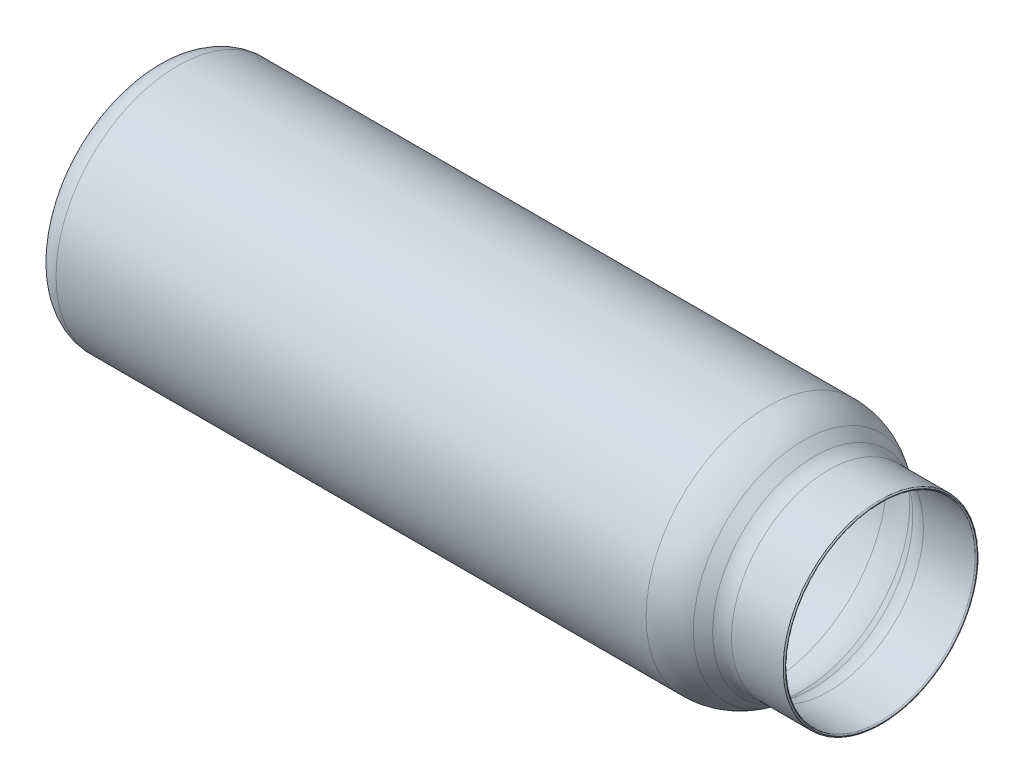
ISO-10303-21;
HEADER;
FILE_DESCRIPTION(('STEP AP214'),'2;1');
FILE_NAME('part.step','',(''),(''),'','','');
FILE_SCHEMA(('AUTOMOTIVE_DESIGN { 1 0 10303 214 1 1 1 1 }'));
ENDSEC;
DATA;
#1=APPLICATION_CONTEXT('core data for automotive mechanical design processes');
#2=APPLICATION_PROTOCOL_DEFINITION('international standard','automotive_design',2000,#1);
#3=PRODUCT_CONTEXT('',#1,'mechanical');
#4=PRODUCT('Part','Part','',(#3));
#5=PRODUCT_RELATED_PRODUCT_CATEGORY('part','',(#4));
#6=PRODUCT_DEFINITION_FORMATION('','',#4);
#7=PRODUCT_DEFINITION_CONTEXT('part definition',#1,'design');
#8=PRODUCT_DEFINITION('design','',#6,#7);
#9=PRODUCT_DEFINITION_SHAPE('','',#8);
#10=(LENGTH_UNIT() NAMED_UNIT(*) SI_UNIT(.MILLI.,.METRE.));
#11=(NAMED_UNIT(*) PLANE_ANGLE_UNIT() SI_UNIT($,.RADIAN.));
#12=(NAMED_UNIT(*) SI_UNIT($,.STERADIAN.) SOLID_ANGLE_UNIT());
#13=UNCERTAINTY_MEASURE_WITH_UNIT(LENGTH_MEASURE(1.E-05),#10,'distance_accuracy_value','');
#14=(GEOMETRIC_REPRESENTATION_CONTEXT(3) GLOBAL_UNCERTAINTY_ASSIGNED_CONTEXT((#13)) GLOBAL_UNIT_ASSIGNED_CONTEXT((#10,
#11,#12)) REPRESENTATION_CONTEXT('',''));
#15=CARTESIAN_POINT('',(0.,0.,0.));
#16=DIRECTION('',(0.,0.,1.));
#17=DIRECTION('',(1.,0.,0.));
#18=AXIS2_PLACEMENT_3D('',#15,#16,#17);
#19=CARTESIAN_POINT('',(-61.7247366660673,0.,0.));
#20=DIRECTION('',(-1.,0.,0.));
#21=DIRECTION('',(0.,-1.,0.));
#22=AXIS2_PLACEMENT_3D('',#19,#20,#21);
#23=TOROIDAL_SURFACE('',#22,8.00000000000002,1.99999999999999);
#24=CARTESIAN_POINT('',(-61.7247366660673,0.,0.));
#25=DIRECTION('',(-1.,0.,0.));
#26=DIRECTION('',(0.,-1.,0.));
#27=AXIS2_PLACEMENT_3D('',#24,#25,#26);
#28=CIRCLE('',#27,10.);
#29=CARTESIAN_POINT('',(-61.7247366660673,-10.,0.));
#30=VERTEX_POINT('',#29);
#31=EDGE_CURVE('E67',#30,#30,#28,.T.);
#32=ORIENTED_EDGE('',*,*,#31,.T.);
#33=EDGE_LOOP('',(#32));
#34=FACE_BOUND('',#33,.T.);
#35=CARTESIAN_POINT('',(-63.7179604760065,0.,0.));
#36=DIRECTION('',(-1.,0.,0.));
#37=DIRECTION('',(0.,-1.,0.));
#38=AXIS2_PLACEMENT_3D('',#35,#36,#37);
#39=CIRCLE('',#38,7.83550427515771);
#40=CARTESIAN_POINT('',(-63.7179604760065,-7.83550427515772,0.));
#41=VERTEX_POINT('',#40);
#42=EDGE_CURVE('E107',#41,#41,#39,.T.);
#43=ORIENTED_EDGE('',*,*,#42,.F.);
#44=EDGE_LOOP('',(#43));
#45=FACE_BOUND('',#44,.T.);
#46=ADVANCED_FACE('F40',(#34,#45),#23,.T.);
#47=CARTESIAN_POINT('',(-188.294448597208,2.44547852748503,0.));
#48=DIRECTION('',(0.,0.,-1.));
#49=DIRECTION('',(0.,-1.,0.));
#50=AXIS2_PLACEMENT_3D('',#47,#48,#49);
#51=CIRCLE('',#50,125.);
#52=TRIMMED_CURVE('',#51,(PARAMETER_VALUE(-1.55123125037242)),
(PARAMETER_VALUE(1.55123125037242)),.T.,.PARAMETER.);
#53=CARTESIAN_POINT('',(-188.294448597208,0.,0.));
#54=DIRECTION('',(-1.,0.,0.));
#55=AXIS1_PLACEMENT('',#53,#54);
#56=SURFACE_OF_REVOLUTION('',#52,#55);
#57=CARTESIAN_POINT('',(-63.3183723475045,0.,0.));
#58=VERTEX_POINT('',#57);
#59=VERTEX_LOOP('',#58);
#60=FACE_BOUND('',#59,.T.);
#61=ORIENTED_EDGE('',*,*,#42,.T.);
#62=EDGE_LOOP('',(#61));
#63=FACE_BOUND('',#62,.T.);
#64=ADVANCED_FACE('F129',(#60,#63),#56,.F.);
#65=CARTESIAN_POINT('',(-65.5929032966572,0.,0.));
#66=DIRECTION('',(-1.,0.,0.));
#67=DIRECTION('',(0.,-1.,0.));
#68=AXIS2_PLACEMENT_3D('',#65,#66,#67);
#69=CYLINDRICAL_SURFACE('',#68,8.);
#70=CARTESIAN_POINT('',(-3.88971227626985,0.,0.));
#71=DIRECTION('',(1.,0.,0.));
#72=DIRECTION('',(0.,1.,0.));
#73=AXIS2_PLACEMENT_3D('',#70,#71,#72);
#74=CIRCLE('',#73,8.);
#75=CARTESIAN_POINT('',(-3.88971227626985,7.99999999999999,0.));
#76=VERTEX_POINT('',#75);
#77=EDGE_CURVE('E50',#76,#76,#74,.F.);
#78=ORIENTED_EDGE('',*,*,#77,.T.);
#79=EDGE_LOOP('',(#78));
#80=FACE_BOUND('',#79,.T.);
#81=CARTESIAN_POINT('',(-8.1405229888387,0.,0.));
#82=DIRECTION('',(-1.,0.,0.));
#83=DIRECTION('',(0.,-1.,0.));
#84=AXIS2_PLACEMENT_3D('',#81,#82,#83);
#85=CIRCLE('',#84,8.);
#86=CARTESIAN_POINT('',(-8.1405229888387,-8.00000000000001,0.));
#87=VERTEX_POINT('',#86);
#88=EDGE_CURVE('E103',#87,#87,#85,.T.);
#89=ORIENTED_EDGE('',*,*,#88,.F.);
#90=EDGE_LOOP('',(#89));
#91=FACE_BOUND('',#90,.T.);
#92=ADVANCED_FACE('F115',(#80,#91),#69,.T.);
#93=CARTESIAN_POINT('',(-8.1405229888387,0.,0.));
#94=DIRECTION('',(-1.,0.,0.));
#95=DIRECTION('',(0.,-1.,0.));
#96=AXIS2_PLACEMENT_3D('',#93,#94,#95);
#97=TOROIDAL_SURFACE('',#96,10.,2.);
#98=CARTESIAN_POINT('',(-9.31514175403504,0.,0.));
#99=DIRECTION('',(-1.,0.,0.));
#100=DIRECTION('',(0.,-1.,0.));
#101=AXIS2_PLACEMENT_3D('',#98,#99,#100);
#102=CIRCLE('',#101,8.38127495959054);
#103=CARTESIAN_POINT('',(-9.31514175403504,-8.38127495959055,0.));
#104=VERTEX_POINT('',#103);
#105=EDGE_CURVE('E99',#104,#104,#102,.T.);
#106=ORIENTED_EDGE('',*,*,#105,.F.);
#107=EDGE_LOOP('',(#106));
#108=FACE_BOUND('',#107,.T.);
#109=ORIENTED_EDGE('',*,*,#88,.T.);
#110=EDGE_LOOP('',(#109));
#111=FACE_BOUND('',#110,.T.);
#112=ADVANCED_FACE('F139',(#108,#111),#97,.F.);
#113=CARTESIAN_POINT('',(-10.232309500238,0.,0.));
#114=DIRECTION('',(-1.,0.,0.));
#115=DIRECTION('',(0.,-1.,0.));
#116=AXIS2_PLACEMENT_3D('',#113,#114,#115);
#117=CONICAL_SURFACE('',#116,9.04681260102366,0.627730449027224);
#118=ORIENTED_EDGE('',*,*,#105,.T.);
#119=EDGE_LOOP('',(#118));
#120=FACE_BOUND('',#119,.T.);
#121=CARTESIAN_POINT('',(-10.232309500238,0.,0.));
#122=DIRECTION('',(-1.,0.,0.));
#123=DIRECTION('',(0.,-1.,0.));
#124=AXIS2_PLACEMENT_3D('',#121,#122,#123);
#125=CIRCLE('',#124,9.04681260102366);
#126=CARTESIAN_POINT('',(-10.232309500238,-9.04681260102367,0.));
#127=VERTEX_POINT('',#126);
#128=EDGE_CURVE('E95',#127,#127,#125,.T.);
#129=ORIENTED_EDGE('',*,*,#128,.F.);
#130=EDGE_LOOP('',(#129));
#131=FACE_BOUND('',#130,.T.);
#132=ADVANCED_FACE('F142',(#120,#131),#117,.T.);
#133=CARTESIAN_POINT('',(-13.1688564132289,0.,0.));
#134=DIRECTION('',(-1.,0.,0.));
#135=DIRECTION('',(0.,-1.,0.));
#136=AXIS2_PLACEMENT_3D('',#133,#134,#135);
#137=TOROIDAL_SURFACE('',#136,5.,5.);
#138=ORIENTED_EDGE('',*,*,#128,.T.);
#139=EDGE_LOOP('',(#138));
#140=FACE_BOUND('',#139,.T.);
#141=CARTESIAN_POINT('',(-13.1688564132289,0.,0.));
#142=DIRECTION('',(-1.,0.,0.));
#143=DIRECTION('',(0.,-1.,0.));
#144=AXIS2_PLACEMENT_3D('',#141,#142,#143);
#145=CIRCLE('',#144,10.);
#146=CARTESIAN_POINT('',(-13.1688564132289,-10.,0.));
#147=VERTEX_POINT('',#146);
#148=EDGE_CURVE('E73',#147,#147,#145,.T.);
#149=ORIENTED_EDGE('',*,*,#148,.F.);
#150=EDGE_LOOP('',(#149));
#151=FACE_BOUND('',#150,.T.);
#152=ADVANCED_FACE('F146',(#140,#151),#137,.T.);
#153=CARTESIAN_POINT('',(-65.5929032966572,0.,0.));
#154=DIRECTION('',(-1.,0.,0.));
#155=DIRECTION('',(0.,-1.,0.));
#156=AXIS2_PLACEMENT_3D('',#153,#154,#155);
#157=CYLINDRICAL_SURFACE('',#156,10.);
#158=ORIENTED_EDGE('',*,*,#148,.T.);
#159=EDGE_LOOP('',(#158));
#160=FACE_BOUND('',#159,.T.);
#161=ORIENTED_EDGE('',*,*,#31,.F.);
#162=EDGE_LOOP('',(#161));
#163=FACE_BOUND('',#162,.T.);
#164=ADVANCED_FACE('F150',(#160,#163),#157,.T.);
#165=CARTESIAN_POINT('',(-61.7247366660673,0.,0.));
#166=DIRECTION('',(-1.,0.,0.));
#167=DIRECTION('',(0.,-1.,0.));
#168=AXIS2_PLACEMENT_3D('',#165,#166,#167);
#169=TOROIDAL_SURFACE('',#168,8.00000000000002,1.79999999999999);
#170=CARTESIAN_POINT('',(-61.7247366660673,0.,0.));
#171=DIRECTION('',(-1.,0.,0.));
#172=DIRECTION('',(0.,-1.,0.));
#173=AXIS2_PLACEMENT_3D('',#170,#171,#172);
#174=CIRCLE('',#173,9.80000000000001);
#175=CARTESIAN_POINT('',(-61.7247366660673,-9.80000000000002,0.));
#176=VERTEX_POINT('',#175);
#177=EDGE_CURVE('E80',#176,#176,#174,.T.);
#178=ORIENTED_EDGE('',*,*,#177,.F.);
#179=EDGE_LOOP('',(#178));
#180=FACE_BOUND('',#179,.T.);
#181=CARTESIAN_POINT('',(-63.5186380950126,0.,0.));
#182=DIRECTION('',(-1.,0.,0.));
#183=DIRECTION('',(0.,-1.,0.));
#184=AXIS2_PLACEMENT_3D('',#181,#182,#183);
#185=CIRCLE('',#184,7.85195384764193);
#186=CARTESIAN_POINT('',(-63.5186380950126,-7.85195384764194,0.));
#187=VERTEX_POINT('',#186);
#188=EDGE_CURVE('E64',#187,#187,#185,.T.);
#189=ORIENTED_EDGE('',*,*,#188,.T.);
#190=EDGE_LOOP('',(#189));
#191=FACE_BOUND('',#190,.T.);
#192=ADVANCED_FACE('F60',(#180,#191),#169,.F.);
#193=CARTESIAN_POINT('',(-188.294448597208,2.44547852748503,0.));
#194=DIRECTION('',(0.,0.,-1.));
#195=DIRECTION('',(0.,-1.,0.));
#196=AXIS2_PLACEMENT_3D('',#193,#194,#195);
#197=CIRCLE('',#196,125.2);
#198=TRIMMED_CURVE('',#197,(PARAMETER_VALUE(-1.55126250846711)),
(PARAMETER_VALUE(1.55126250846711)),.T.,.PARAMETER.);
#199=CARTESIAN_POINT('',(-188.294448597208,0.,0.));
#200=DIRECTION('',(-1.,0.,0.));
#201=AXIS1_PLACEMENT('',#199,#200);
#202=SURFACE_OF_REVOLUTION('',#198,#201);
#203=CARTESIAN_POINT('',(-63.1183341233528,0.,0.));
#204=VERTEX_POINT('',#203);
#205=VERTEX_LOOP('',#204);
#206=FACE_BOUND('',#205,.T.);
#207=ORIENTED_EDGE('',*,*,#188,.F.);
#208=EDGE_LOOP('',(#207));
#209=FACE_BOUND('',#208,.T.);
#210=ADVANCED_FACE('F56',(#206,#209),#202,.T.);
#211=CARTESIAN_POINT('',(-65.5929032966572,0.,0.));
#212=DIRECTION('',(-1.,0.,0.));
#213=DIRECTION('',(0.,-1.,0.));
#214=AXIS2_PLACEMENT_3D('',#211,#212,#213);
#215=CYLINDRICAL_SURFACE('',#214,7.8);
#216=CARTESIAN_POINT('',(-3.88971227626985,0.,0.));
#217=DIRECTION('',(1.,0.,0.));
#218=DIRECTION('',(0.,1.,0.));
#219=AXIS2_PLACEMENT_3D('',#216,#217,#218);
#220=CIRCLE('',#219,7.8);
#221=CARTESIAN_POINT('',(-3.88971227626985,7.79999999999999,0.));
#222=VERTEX_POINT('',#221);
#223=EDGE_CURVE('E11',#222,#222,#220,.T.);
#224=ORIENTED_EDGE('',*,*,#223,.T.);
#225=EDGE_LOOP('',(#224));
#226=FACE_BOUND('',#225,.T.);
#227=CARTESIAN_POINT('',(-8.14052298883869,0.,0.));
#228=DIRECTION('',(-1.,0.,0.));
#229=DIRECTION('',(0.,-1.,0.));
#230=AXIS2_PLACEMENT_3D('',#227,#228,#229);
#231=CIRCLE('',#230,7.8);
#232=CARTESIAN_POINT('',(-8.14052298883869,-7.80000000000001,0.));
#233=VERTEX_POINT('',#232);
#234=EDGE_CURVE('E68',#233,#233,#231,.T.);
#235=ORIENTED_EDGE('',*,*,#234,.T.);
#236=EDGE_LOOP('',(#235));
#237=FACE_BOUND('',#236,.T.);
#238=ADVANCED_FACE('F59',(#226,#237),#215,.F.);
#239=CARTESIAN_POINT('',(-8.1405229888387,0.,0.));
#240=DIRECTION('',(-1.,0.,0.));
#241=DIRECTION('',(0.,-1.,0.));
#242=AXIS2_PLACEMENT_3D('',#239,#240,#241);
#243=TOROIDAL_SURFACE('',#242,10.,2.2);
#244=CARTESIAN_POINT('',(-9.43260363055468,0.,0.));
#245=DIRECTION('',(-1.,0.,0.));
#246=DIRECTION('',(0.,-1.,0.));
#247=AXIS2_PLACEMENT_3D('',#244,#245,#246);
#248=CIRCLE('',#247,8.21940245554959);
#249=CARTESIAN_POINT('',(-9.43260363055468,-8.2194024555496,0.));
#250=VERTEX_POINT('',#249);
#251=EDGE_CURVE('E76',#250,#250,#248,.T.);
#252=ORIENTED_EDGE('',*,*,#251,.T.);
#253=EDGE_LOOP('',(#252));
#254=FACE_BOUND('',#253,.T.);
#255=ORIENTED_EDGE('',*,*,#234,.F.);
#256=EDGE_LOOP('',(#255));
#257=FACE_BOUND('',#256,.T.);
#258=ADVANCED_FACE('F165',(#254,#257),#243,.T.);
#259=CARTESIAN_POINT('',(-10.3497713767577,0.,0.));
#260=DIRECTION('',(-1.,0.,0.));
#261=DIRECTION('',(0.,-1.,0.));
#262=AXIS2_PLACEMENT_3D('',#259,#260,#261);
#263=CONICAL_SURFACE('',#262,8.88494009698271,0.627730449027224);
#264=ORIENTED_EDGE('',*,*,#251,.F.);
#265=EDGE_LOOP('',(#264));
#266=FACE_BOUND('',#265,.T.);
#267=CARTESIAN_POINT('',(-10.3497713767577,0.,0.));
#268=DIRECTION('',(-1.,0.,0.));
#269=DIRECTION('',(0.,-1.,0.));
#270=AXIS2_PLACEMENT_3D('',#267,#268,#269);
#271=CIRCLE('',#270,8.88494009698272);
#272=CARTESIAN_POINT('',(-10.3497713767577,-8.88494009698273,0.));
#273=VERTEX_POINT('',#272);
#274=EDGE_CURVE('E85',#273,#273,#271,.T.);
#275=ORIENTED_EDGE('',*,*,#274,.T.);
#276=EDGE_LOOP('',(#275));
#277=FACE_BOUND('',#276,.T.);
#278=ADVANCED_FACE('F161',(#266,#277),#263,.F.);
#279=CARTESIAN_POINT('',(-13.1688564132289,0.,0.));
#280=DIRECTION('',(-1.,0.,0.));
#281=DIRECTION('',(0.,-1.,0.));
#282=AXIS2_PLACEMENT_3D('',#279,#280,#281);
#283=TOROIDAL_SURFACE('',#282,5.,4.8);
#284=ORIENTED_EDGE('',*,*,#274,.F.);
#285=EDGE_LOOP('',(#284));
#286=FACE_BOUND('',#285,.T.);
#287=CARTESIAN_POINT('',(-13.1688564132289,0.,0.));
#288=DIRECTION('',(-1.,0.,0.));
#289=DIRECTION('',(0.,-1.,0.));
#290=AXIS2_PLACEMENT_3D('',#287,#288,#289);
#291=CIRCLE('',#290,9.80000000000001);
#292=CARTESIAN_POINT('',(-13.1688564132289,-9.80000000000002,0.));
#293=VERTEX_POINT('',#292);
#294=EDGE_CURVE('E81',#293,#293,#291,.T.);
#295=ORIENTED_EDGE('',*,*,#294,.T.);
#296=EDGE_LOOP('',(#295));
#297=FACE_BOUND('',#296,.T.);
#298=ADVANCED_FACE('F157',(#286,#297),#283,.F.);
#299=CARTESIAN_POINT('',(-65.5929032966572,0.,0.));
#300=DIRECTION('',(-1.,0.,0.));
#301=DIRECTION('',(0.,-1.,0.));
#302=AXIS2_PLACEMENT_3D('',#299,#300,#301);
#303=CYLINDRICAL_SURFACE('',#302,9.80000000000001);
#304=ORIENTED_EDGE('',*,*,#294,.F.);
#305=EDGE_LOOP('',(#304));
#306=FACE_BOUND('',#305,.T.);
#307=ORIENTED_EDGE('',*,*,#177,.T.);
#308=EDGE_LOOP('',(#307));
#309=FACE_BOUND('',#308,.T.);
#310=ADVANCED_FACE('F124',(#306,#309),#303,.F.);
#311=CARTESIAN_POINT('',(-3.88971227626985,0.,0.));
#312=DIRECTION('',(1.,0.,0.));
#313=DIRECTION('',(0.,1.,0.));
#314=AXIS2_PLACEMENT_3D('',#311,#312,#313);
#315=TOROIDAL_SURFACE('',#314,7.9,0.1);
#316=ORIENTED_EDGE('',*,*,#223,.F.);
#317=EDGE_LOOP('',(#316));
#318=FACE_BOUND('',#317,.T.);
#319=CARTESIAN_POINT('',(-3.78971227626985,0.,0.));
#320=DIRECTION('',(1.,0.,0.));
#321=DIRECTION('',(0.,1.,0.));
#322=AXIS2_PLACEMENT_3D('',#319,#320,#321);
#323=CIRCLE('',#322,7.9);
#324=CARTESIAN_POINT('',(-3.78971227626985,7.89999999999999,0.));
#325=VERTEX_POINT('',#324);
#326=EDGE_CURVE('E44',#325,#325,#323,.F.);
#327=ORIENTED_EDGE('',*,*,#326,.F.);
#328=EDGE_LOOP('',(#327));
#329=FACE_BOUND('',#328,.T.);
#330=ADVANCED_FACE('F42',(#318,#329),#315,.T.);
#331=CARTESIAN_POINT('',(-3.88971227626985,0.,0.));
#332=DIRECTION('',(1.,0.,0.));
#333=DIRECTION('',(0.,1.,0.));
#334=AXIS2_PLACEMENT_3D('',#331,#332,#333);
#335=TOROIDAL_SURFACE('',#334,7.9,0.1);
#336=ORIENTED_EDGE('',*,*,#326,.T.);
#337=EDGE_LOOP('',(#336));
#338=FACE_BOUND('',#337,.T.);
#339=ORIENTED_EDGE('',*,*,#77,.F.);
#340=EDGE_LOOP('',(#339));
#341=FACE_BOUND('',#340,.T.);
#342=ADVANCED_FACE('F118',(#338,#341),#335,.T.);
#343=CLOSED_SHELL('',(#46,#64,#92,#112,#132,#152,#164,#192,#210,#238,#258,#278,#298,#310,#330,#342));
#344=MANIFOLD_SOLID_BREP('B2',#343);
#345=ADVANCED_BREP_SHAPE_REPRESENTATION('',(#18,#344),#14);
#346=SHAPE_DEFINITION_REPRESENTATION(#9,#345);
ENDSEC;
END-ISO-10303-21;
